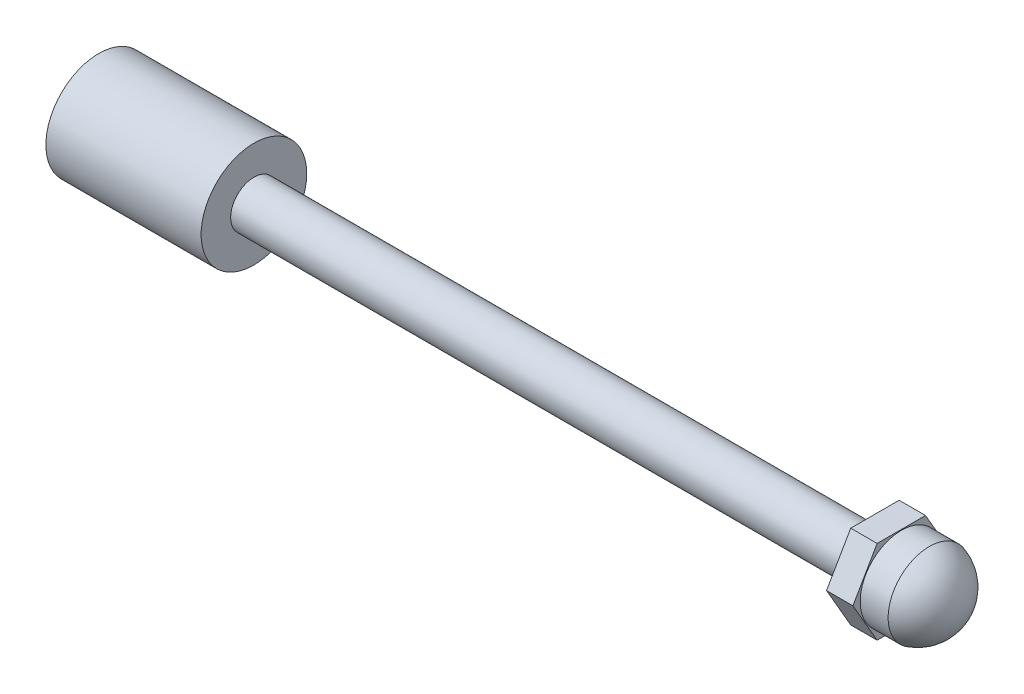
ISO-10303-21;
HEADER;
FILE_DESCRIPTION(('STEP AP214'),'2;1');
FILE_NAME('part.step','',(''),(''),'','','');
FILE_SCHEMA(('AUTOMOTIVE_DESIGN { 1 0 10303 214 1 1 1 1 }'));
ENDSEC;
DATA;
#1=APPLICATION_CONTEXT('core data for automotive mechanical design processes');
#2=APPLICATION_PROTOCOL_DEFINITION('international standard','automotive_design',2000,#1);
#3=PRODUCT_CONTEXT('',#1,'mechanical');
#4=PRODUCT('Part','Part','',(#3));
#5=PRODUCT_RELATED_PRODUCT_CATEGORY('part','',(#4));
#6=PRODUCT_DEFINITION_FORMATION('','',#4);
#7=PRODUCT_DEFINITION_CONTEXT('part definition',#1,'design');
#8=PRODUCT_DEFINITION('design','',#6,#7);
#9=PRODUCT_DEFINITION_SHAPE('','',#8);
#10=(LENGTH_UNIT() NAMED_UNIT(*) SI_UNIT(.MILLI.,.METRE.));
#11=(NAMED_UNIT(*) PLANE_ANGLE_UNIT() SI_UNIT($,.RADIAN.));
#12=(NAMED_UNIT(*) SI_UNIT($,.STERADIAN.) SOLID_ANGLE_UNIT());
#13=UNCERTAINTY_MEASURE_WITH_UNIT(LENGTH_MEASURE(1.E-05),#10,'distance_accuracy_value','');
#14=(GEOMETRIC_REPRESENTATION_CONTEXT(3) GLOBAL_UNCERTAINTY_ASSIGNED_CONTEXT((#13)) GLOBAL_UNIT_ASSIGNED_CONTEXT((#10,
#11,#12)) REPRESENTATION_CONTEXT('',''));
#15=CARTESIAN_POINT('',(0.,0.,0.));
#16=DIRECTION('',(0.,0.,1.));
#17=DIRECTION('',(1.,0.,0.));
#18=AXIS2_PLACEMENT_3D('',#15,#16,#17);
#19=CARTESIAN_POINT('',(10.,0.,0.));
#20=DIRECTION('',(-1.,0.,0.));
#21=DIRECTION('',(0.,0.,1.));
#22=AXIS2_PLACEMENT_3D('',#19,#20,#21);
#23=CYLINDRICAL_SURFACE('',#22,3.4);
#24=CARTESIAN_POINT('',(10.,0.,0.));
#25=DIRECTION('',(1.,0.,0.));
#26=DIRECTION('',(0.,0.,-1.));
#27=AXIS2_PLACEMENT_3D('',#24,#25,#26);
#28=CIRCLE('',#27,3.4);
#29=CARTESIAN_POINT('',(10.,0.,-3.4));
#30=VERTEX_POINT('',#29);
#31=EDGE_CURVE('E176',#30,#30,#28,.T.);
#32=ORIENTED_EDGE('',*,*,#31,.F.);
#33=EDGE_LOOP('',(#32));
#34=FACE_BOUND('',#33,.T.);
#35=CARTESIAN_POINT('',(0.,0.,0.));
#36=DIRECTION('',(1.,0.,0.));
#37=DIRECTION('',(0.,0.,-1.));
#38=AXIS2_PLACEMENT_3D('',#35,#36,#37);
#39=CIRCLE('',#38,3.4);
#40=CARTESIAN_POINT('',(0.,0.,-3.4));
#41=VERTEX_POINT('',#40);
#42=EDGE_CURVE('E172',#41,#41,#39,.T.);
#43=ORIENTED_EDGE('',*,*,#42,.T.);
#44=EDGE_LOOP('',(#43));
#45=FACE_BOUND('',#44,.T.);
#46=ADVANCED_FACE('F45',(#34,#45),#23,.T.);
#47=CARTESIAN_POINT('',(10.,0.,0.));
#48=DIRECTION('',(1.,0.,0.));
#49=DIRECTION('',(0.,0.,-1.));
#50=AXIS2_PLACEMENT_3D('',#47,#48,#49);
#51=PLANE('',#50);
#52=CARTESIAN_POINT('',(10.,0.,0.));
#53=DIRECTION('',(1.,0.,0.));
#54=DIRECTION('',(0.,0.,-1.));
#55=AXIS2_PLACEMENT_3D('',#52,#53,#54);
#56=CIRCLE('',#55,1.5);
#57=CARTESIAN_POINT('',(10.,0.,-1.5));
#58=VERTEX_POINT('',#57);
#59=EDGE_CURVE('E56',#58,#58,#56,.T.);
#60=ORIENTED_EDGE('',*,*,#59,.F.);
#61=EDGE_LOOP('',(#60));
#62=FACE_BOUND('',#61,.T.);
#63=ORIENTED_EDGE('',*,*,#31,.T.);
#64=EDGE_LOOP('',(#63));
#65=FACE_BOUND('',#64,.T.);
#66=ADVANCED_FACE('F187',(#62,#65),#51,.T.);
#67=CARTESIAN_POINT('',(0.,0.,0.));
#68=DIRECTION('',(1.,0.,0.));
#69=DIRECTION('',(0.,0.,-1.));
#70=AXIS2_PLACEMENT_3D('',#67,#68,#69);
#71=PLANE('',#70);
#72=ORIENTED_EDGE('',*,*,#42,.F.);
#73=EDGE_LOOP('',(#72));
#74=FACE_BOUND('',#73,.T.);
#75=ADVANCED_FACE('F184',(#74),#71,.F.);
#76=CARTESIAN_POINT('',(50.,0.,0.));
#77=DIRECTION('',(-1.,0.,0.));
#78=DIRECTION('',(0.,0.,1.));
#79=AXIS2_PLACEMENT_3D('',#76,#77,#78);
#80=CYLINDRICAL_SURFACE('',#79,1.5);
#81=CARTESIAN_POINT('',(50.,0.,0.));
#82=DIRECTION('',(1.,0.,0.));
#83=DIRECTION('',(0.,0.,-1.));
#84=AXIS2_PLACEMENT_3D('',#81,#82,#83);
#85=CIRCLE('',#84,1.5);
#86=CARTESIAN_POINT('',(50.,0.,-1.5));
#87=VERTEX_POINT('',#86);
#88=EDGE_CURVE('E168',#87,#87,#85,.T.);
#89=ORIENTED_EDGE('',*,*,#88,.F.);
#90=EDGE_LOOP('',(#89));
#91=FACE_BOUND('',#90,.T.);
#92=ORIENTED_EDGE('',*,*,#59,.T.);
#93=EDGE_LOOP('',(#92));
#94=FACE_BOUND('',#93,.T.);
#95=ADVANCED_FACE('F186',(#91,#94),#80,.T.);
#96=CARTESIAN_POINT('',(51.7,0.,3.11769145362398));
#97=DIRECTION('',(0.,-0.5,-0.866025403784439));
#98=DIRECTION('',(0.,0.866025403784439,-0.5));
#99=AXIS2_PLACEMENT_3D('',#96,#97,#98);
#100=PLANE('',#99);
#101=DIRECTION('',(0.,-0.866025403784439,0.5));
#102=VECTOR('',#101,1.);
#103=CARTESIAN_POINT('',(50.,0.,3.11769145362398));
#104=LINE('',#103,#102);
#105=CARTESIAN_POINT('',(50.,2.7,1.55884572681199));
#106=VERTEX_POINT('',#105);
#107=CARTESIAN_POINT('',(50.,0.,3.11769145362398));
#108=VERTEX_POINT('',#107);
#109=EDGE_CURVE('E138',#106,#108,#104,.T.);
#110=ORIENTED_EDGE('',*,*,#109,.T.);
#111=DIRECTION('',(-1.,0.,0.));
#112=VECTOR('',#111,1.);
#113=CARTESIAN_POINT('',(51.7,0.,3.11769145362398));
#114=LINE('',#113,#112);
#115=CARTESIAN_POINT('',(51.7,0.,3.11769145362398));
#116=VERTEX_POINT('',#115);
#117=EDGE_CURVE('E165',#116,#108,#114,.T.);
#118=ORIENTED_EDGE('',*,*,#117,.F.);
#119=DIRECTION('',(0.,-0.866025403784439,0.5));
#120=VECTOR('',#119,1.);
#121=CARTESIAN_POINT('',(51.7,0.,3.11769145362398));
#122=LINE('',#121,#120);
#123=CARTESIAN_POINT('',(51.7,2.7,1.55884572681199));
#124=VERTEX_POINT('',#123);
#125=EDGE_CURVE('E154',#124,#116,#122,.T.);
#126=ORIENTED_EDGE('',*,*,#125,.F.);
#127=DIRECTION('',(-1.,0.,0.));
#128=VECTOR('',#127,1.);
#129=CARTESIAN_POINT('',(51.7,2.7,1.55884572681199));
#130=LINE('',#129,#128);
#131=EDGE_CURVE('E134',#124,#106,#130,.T.);
#132=ORIENTED_EDGE('',*,*,#131,.T.);
#133=EDGE_LOOP('',(#110,#118,#126,#132));
#134=FACE_BOUND('',#133,.T.);
#135=ADVANCED_FACE('F193',(#134),#100,.F.);
#136=CARTESIAN_POINT('',(51.7,-2.7,1.55884572681199));
#137=DIRECTION('',(0.,0.5,-0.866025403784438));
#138=DIRECTION('',(0.,0.866025403784439,0.5));
#139=AXIS2_PLACEMENT_3D('',#136,#137,#138);
#140=PLANE('',#139);
#141=DIRECTION('',(0.,-0.866025403784438,-0.5));
#142=VECTOR('',#141,1.);
#143=CARTESIAN_POINT('',(50.,-2.7,1.55884572681199));
#144=LINE('',#143,#142);
#145=CARTESIAN_POINT('',(50.,-2.7,1.55884572681199));
#146=VERTEX_POINT('',#145);
#147=EDGE_CURVE('E142',#108,#146,#144,.T.);
#148=ORIENTED_EDGE('',*,*,#147,.T.);
#149=DIRECTION('',(-1.,0.,0.));
#150=VECTOR('',#149,1.);
#151=CARTESIAN_POINT('',(51.7,-2.7,1.55884572681199));
#152=LINE('',#151,#150);
#153=CARTESIAN_POINT('',(51.7,-2.7,1.55884572681199));
#154=VERTEX_POINT('',#153);
#155=EDGE_CURVE('E161',#154,#146,#152,.T.);
#156=ORIENTED_EDGE('',*,*,#155,.F.);
#157=DIRECTION('',(0.,-0.866025403784438,-0.5));
#158=VECTOR('',#157,1.);
#159=CARTESIAN_POINT('',(51.7,-2.7,1.55884572681199));
#160=LINE('',#159,#158);
#161=EDGE_CURVE('E103',#116,#154,#160,.T.);
#162=ORIENTED_EDGE('',*,*,#161,.F.);
#163=ORIENTED_EDGE('',*,*,#117,.T.);
#164=EDGE_LOOP('',(#148,#156,#162,#163));
#165=FACE_BOUND('',#164,.T.);
#166=ADVANCED_FACE('F227',(#165),#140,.F.);
#167=CARTESIAN_POINT('',(51.7,-2.7,-1.55884572681199));
#168=DIRECTION('',(0.,1.,0.));
#169=DIRECTION('',(0.,0.,1.));
#170=AXIS2_PLACEMENT_3D('',#167,#168,#169);
#171=PLANE('',#170);
#172=DIRECTION('',(0.,0.,-1.));
#173=VECTOR('',#172,1.);
#174=CARTESIAN_POINT('',(50.,-2.7,-1.55884572681199));
#175=LINE('',#174,#173);
#176=CARTESIAN_POINT('',(50.,-2.7,-1.55884572681199));
#177=VERTEX_POINT('',#176);
#178=EDGE_CURVE('E145',#146,#177,#175,.T.);
#179=ORIENTED_EDGE('',*,*,#178,.T.);
#180=DIRECTION('',(-1.,0.,0.));
#181=VECTOR('',#180,1.);
#182=CARTESIAN_POINT('',(51.7,-2.7,-1.55884572681199));
#183=LINE('',#182,#181);
#184=CARTESIAN_POINT('',(51.7,-2.7,-1.55884572681199));
#185=VERTEX_POINT('',#184);
#186=EDGE_CURVE('E127',#185,#177,#183,.T.);
#187=ORIENTED_EDGE('',*,*,#186,.F.);
#188=DIRECTION('',(0.,0.,-1.));
#189=VECTOR('',#188,1.);
#190=CARTESIAN_POINT('',(51.7,-2.7,-1.55884572681199));
#191=LINE('',#190,#189);
#192=EDGE_CURVE('E116',#154,#185,#191,.T.);
#193=ORIENTED_EDGE('',*,*,#192,.F.);
#194=ORIENTED_EDGE('',*,*,#155,.T.);
#195=EDGE_LOOP('',(#179,#187,#193,#194));
#196=FACE_BOUND('',#195,.T.);
#197=ADVANCED_FACE('F238',(#196),#171,.F.);
#198=CARTESIAN_POINT('',(51.7,0.,-3.11769145362398));
#199=DIRECTION('',(0.,0.5,0.866025403784439));
#200=DIRECTION('',(0.,-0.866025403784439,0.5));
#201=AXIS2_PLACEMENT_3D('',#198,#199,#200);
#202=PLANE('',#201);
#203=DIRECTION('',(0.,0.866025403784439,-0.5));
#204=VECTOR('',#203,1.);
#205=CARTESIAN_POINT('',(50.,0.,-3.11769145362398));
#206=LINE('',#205,#204);
#207=CARTESIAN_POINT('',(50.,0.,-3.11769145362398));
#208=VERTEX_POINT('',#207);
#209=EDGE_CURVE('E125',#177,#208,#206,.T.);
#210=ORIENTED_EDGE('',*,*,#209,.T.);
#211=DIRECTION('',(-1.,0.,0.));
#212=VECTOR('',#211,1.);
#213=CARTESIAN_POINT('',(51.7,0.,-3.11769145362398));
#214=LINE('',#213,#212);
#215=CARTESIAN_POINT('',(51.7,0.,-3.11769145362398));
#216=VERTEX_POINT('',#215);
#217=EDGE_CURVE('E122',#216,#208,#214,.T.);
#218=ORIENTED_EDGE('',*,*,#217,.F.);
#219=DIRECTION('',(0.,0.866025403784439,-0.5));
#220=VECTOR('',#219,1.);
#221=CARTESIAN_POINT('',(51.7,0.,-3.11769145362398));
#222=LINE('',#221,#220);
#223=EDGE_CURVE('E110',#185,#216,#222,.T.);
#224=ORIENTED_EDGE('',*,*,#223,.F.);
#225=ORIENTED_EDGE('',*,*,#186,.T.);
#226=EDGE_LOOP('',(#210,#218,#224,#225));
#227=FACE_BOUND('',#226,.T.);
#228=ADVANCED_FACE('F123',(#227),#202,.F.);
#229=CARTESIAN_POINT('',(51.7,2.7,-1.55884572681199));
#230=DIRECTION('',(0.,-0.5,0.866025403784438));
#231=DIRECTION('',(0.,-0.866025403784439,-0.5));
#232=AXIS2_PLACEMENT_3D('',#229,#230,#231);
#233=PLANE('',#232);
#234=DIRECTION('',(0.,0.866025403784438,0.5));
#235=VECTOR('',#234,1.);
#236=CARTESIAN_POINT('',(50.,2.7,-1.55884572681199));
#237=LINE('',#236,#235);
#238=CARTESIAN_POINT('',(50.,2.7,-1.55884572681199));
#239=VERTEX_POINT('',#238);
#240=EDGE_CURVE('E88',#208,#239,#237,.T.);
#241=ORIENTED_EDGE('',*,*,#240,.T.);
#242=DIRECTION('',(-1.,0.,0.));
#243=VECTOR('',#242,1.);
#244=CARTESIAN_POINT('',(51.7,2.7,-1.55884572681199));
#245=LINE('',#244,#243);
#246=CARTESIAN_POINT('',(51.7,2.7,-1.55884572681199));
#247=VERTEX_POINT('',#246);
#248=EDGE_CURVE('E128',#247,#239,#245,.T.);
#249=ORIENTED_EDGE('',*,*,#248,.F.);
#250=DIRECTION('',(0.,0.866025403784438,0.5));
#251=VECTOR('',#250,1.);
#252=CARTESIAN_POINT('',(51.7,2.7,-1.55884572681199));
#253=LINE('',#252,#251);
#254=EDGE_CURVE('E114',#216,#247,#253,.T.);
#255=ORIENTED_EDGE('',*,*,#254,.F.);
#256=ORIENTED_EDGE('',*,*,#217,.T.);
#257=EDGE_LOOP('',(#241,#249,#255,#256));
#258=FACE_BOUND('',#257,.T.);
#259=ADVANCED_FACE('F130',(#258),#233,.F.);
#260=CARTESIAN_POINT('',(51.7,2.7,1.55884572681199));
#261=DIRECTION('',(0.,-1.,0.));
#262=DIRECTION('',(0.,0.,-1.));
#263=AXIS2_PLACEMENT_3D('',#260,#261,#262);
#264=PLANE('',#263);
#265=DIRECTION('',(0.,0.,1.));
#266=VECTOR('',#265,1.);
#267=CARTESIAN_POINT('',(50.,2.7,1.55884572681199));
#268=LINE('',#267,#266);
#269=EDGE_CURVE('E94',#239,#106,#268,.T.);
#270=ORIENTED_EDGE('',*,*,#269,.T.);
#271=ORIENTED_EDGE('',*,*,#131,.F.);
#272=DIRECTION('',(0.,0.,1.));
#273=VECTOR('',#272,1.);
#274=CARTESIAN_POINT('',(51.7,2.7,1.55884572681199));
#275=LINE('',#274,#273);
#276=EDGE_CURVE('E65',#247,#124,#275,.T.);
#277=ORIENTED_EDGE('',*,*,#276,.F.);
#278=ORIENTED_EDGE('',*,*,#248,.T.);
#279=EDGE_LOOP('',(#270,#271,#277,#278));
#280=FACE_BOUND('',#279,.T.);
#281=ADVANCED_FACE('F267',(#280),#264,.F.);
#282=CARTESIAN_POINT('',(51.7,0.,0.));
#283=DIRECTION('',(-1.,0.,0.));
#284=DIRECTION('',(0.,0.,1.));
#285=AXIS2_PLACEMENT_3D('',#282,#283,#284);
#286=PLANE('',#285);
#287=CARTESIAN_POINT('',(51.7,0.,0.));
#288=DIRECTION('',(1.,0.,0.));
#289=DIRECTION('',(0.,0.,-1.));
#290=AXIS2_PLACEMENT_3D('',#287,#288,#289);
#291=CIRCLE('',#290,2.65);
#292=CARTESIAN_POINT('',(51.7,0.,-2.65));
#293=VERTEX_POINT('',#292);
#294=EDGE_CURVE('E11',#293,#293,#291,.T.);
#295=ORIENTED_EDGE('',*,*,#294,.F.);
#296=EDGE_LOOP('',(#295));
#297=FACE_BOUND('',#296,.T.);
#298=ORIENTED_EDGE('',*,*,#125,.T.);
#299=ORIENTED_EDGE('',*,*,#161,.T.);
#300=ORIENTED_EDGE('',*,*,#192,.T.);
#301=ORIENTED_EDGE('',*,*,#223,.T.);
#302=ORIENTED_EDGE('',*,*,#254,.T.);
#303=ORIENTED_EDGE('',*,*,#276,.T.);
#304=EDGE_LOOP('',(#298,#299,#300,#301,#302,#303));
#305=FACE_BOUND('',#304,.T.);
#306=ADVANCED_FACE('F112',(#297,#305),#286,.F.);
#307=CARTESIAN_POINT('',(50.,0.,0.));
#308=DIRECTION('',(-1.,0.,0.));
#309=DIRECTION('',(0.,0.,1.));
#310=AXIS2_PLACEMENT_3D('',#307,#308,#309);
#311=PLANE('',#310);
#312=ORIENTED_EDGE('',*,*,#88,.T.);
#313=EDGE_LOOP('',(#312));
#314=FACE_BOUND('',#313,.T.);
#315=ORIENTED_EDGE('',*,*,#109,.F.);
#316=ORIENTED_EDGE('',*,*,#269,.F.);
#317=ORIENTED_EDGE('',*,*,#240,.F.);
#318=ORIENTED_EDGE('',*,*,#209,.F.);
#319=ORIENTED_EDGE('',*,*,#178,.F.);
#320=ORIENTED_EDGE('',*,*,#147,.F.);
#321=EDGE_LOOP('',(#315,#316,#317,#318,#319,#320));
#322=FACE_BOUND('',#321,.T.);
#323=ADVANCED_FACE('F284',(#314,#322),#311,.T.);
#324=CARTESIAN_POINT('',(53.5,0.,0.));
#325=DIRECTION('',(-1.,0.,0.));
#326=DIRECTION('',(0.,0.,1.));
#327=AXIS2_PLACEMENT_3D('',#324,#325,#326);
#328=CYLINDRICAL_SURFACE('',#327,2.65);
#329=CARTESIAN_POINT('',(53.5,0.,0.));
#330=DIRECTION('',(1.,0.,0.));
#331=DIRECTION('',(0.,0.,-1.));
#332=AXIS2_PLACEMENT_3D('',#329,#330,#331);
#333=CIRCLE('',#332,2.65);
#334=CARTESIAN_POINT('',(53.5,0.,-2.65));
#335=VERTEX_POINT('',#334);
#336=EDGE_CURVE('E49',#335,#335,#333,.T.);
#337=ORIENTED_EDGE('',*,*,#336,.F.);
#338=EDGE_LOOP('',(#337));
#339=FACE_BOUND('',#338,.T.);
#340=ORIENTED_EDGE('',*,*,#294,.T.);
#341=EDGE_LOOP('',(#340));
#342=FACE_BOUND('',#341,.T.);
#343=ADVANCED_FACE('F289',(#339,#342),#328,.T.);
#344=CARTESIAN_POINT('',(52.744375,0.,0.));
#345=DIRECTION('',(0.,0.,1.));
#346=DIRECTION('',(1.,0.,0.));
#347=AXIS2_PLACEMENT_3D('',#344,#345,#346);
#348=SPHERICAL_SURFACE('',#347,2.755625);
#349=CARTESIAN_POINT('',(52.744375,0.,0.));
#350=DIRECTION('',(1.,0.,0.));
#351=DIRECTION('',(0.,0.,-1.));
#352=AXIS2_PLACEMENT_3D('',#349,#350,#351);
#353=SPHERICAL_SURFACE('',#352,2.755625);
#354=ORIENTED_EDGE('',*,*,#336,.T.);
#355=EDGE_LOOP('',(#354));
#356=FACE_BOUND('',#355,.T.);
#357=ADVANCED_FACE('F47',(#356),#353,.T.);
#358=CLOSED_SHELL('',(#46,#66,#75,#95,#135,#166,#197,#228,#259,#281,#306,#323,#343,#357));
#359=MANIFOLD_SOLID_BREP('B2',#358);
#360=ADVANCED_BREP_SHAPE_REPRESENTATION('',(#18,#359),#14);
#361=SHAPE_DEFINITION_REPRESENTATION(#9,#360);
ENDSEC;
END-ISO-10303-21;
